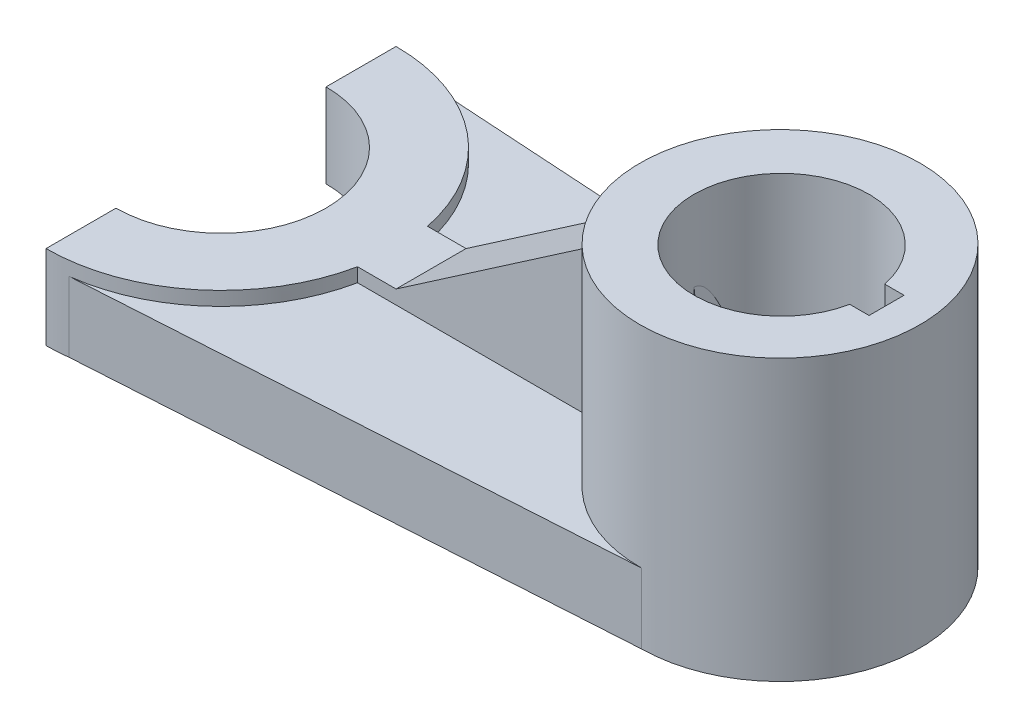
ISO-10303-21;
HEADER;
FILE_DESCRIPTION(('STEP AP214'),'2;1');
FILE_NAME('part.step','',(''),(''),'','','');
FILE_SCHEMA(('AUTOMOTIVE_DESIGN { 1 0 10303 214 1 1 1 1 }'));
ENDSEC;
DATA;
#1=APPLICATION_CONTEXT('core data for automotive mechanical design processes');
#2=APPLICATION_PROTOCOL_DEFINITION('international standard','automotive_design',2000,#1);
#3=PRODUCT_CONTEXT('',#1,'mechanical');
#4=PRODUCT('Part','Part','',(#3));
#5=PRODUCT_RELATED_PRODUCT_CATEGORY('part','',(#4));
#6=PRODUCT_DEFINITION_FORMATION('','',#4);
#7=PRODUCT_DEFINITION_CONTEXT('part definition',#1,'design');
#8=PRODUCT_DEFINITION('design','',#6,#7);
#9=PRODUCT_DEFINITION_SHAPE('','',#8);
#10=(LENGTH_UNIT() NAMED_UNIT(*) SI_UNIT(.MILLI.,.METRE.));
#11=(NAMED_UNIT(*) PLANE_ANGLE_UNIT() SI_UNIT($,.RADIAN.));
#12=(NAMED_UNIT(*) SI_UNIT($,.STERADIAN.) SOLID_ANGLE_UNIT());
#13=UNCERTAINTY_MEASURE_WITH_UNIT(LENGTH_MEASURE(1.E-05),#10,'distance_accuracy_value','');
#14=(GEOMETRIC_REPRESENTATION_CONTEXT(3) GLOBAL_UNCERTAINTY_ASSIGNED_CONTEXT((#13)) GLOBAL_UNIT_ASSIGNED_CONTEXT((#10,
#11,#12)) REPRESENTATION_CONTEXT('',''));
#15=CARTESIAN_POINT('',(0.,0.,0.));
#16=DIRECTION('',(0.,0.,1.));
#17=DIRECTION('',(1.,0.,0.));
#18=AXIS2_PLACEMENT_3D('',#15,#16,#17);
#19=CARTESIAN_POINT('',(-40.,10.0138756603614,0.));
#20=DIRECTION('',(0.,1.,0.));
#21=DIRECTION('',(0.,0.,1.));
#22=AXIS2_PLACEMENT_3D('',#19,#20,#21);
#23=PLANE('',#22);
#24=CARTESIAN_POINT('',(39.8423871101435,10.0138756603614,0.));
#25=DIRECTION('',(0.,1.,0.));
#26=DIRECTION('',(0.,0.,1.));
#27=AXIS2_PLACEMENT_3D('',#24,#25,#26);
#28=CIRCLE('',#27,20.);
#29=CARTESIAN_POINT('',(40.0607651379932,10.0138756603614,19.9988077403867));
#30=VERTEX_POINT('',#29);
#31=CARTESIAN_POINT('',(20.4774703791065,10.0138756603614,5.));
#32=VERTEX_POINT('',#31);
#33=EDGE_CURVE('E273',#30,#32,#28,.F.);
#34=ORIENTED_EDGE('',*,*,#33,.T.);
#35=DIRECTION('',(1.,0.,0.));
#36=VECTOR('',#35,1.);
#37=CARTESIAN_POINT('',(19.8423871101435,10.0138756603614,5.));
#38=LINE('',#37,#36);
#39=CARTESIAN_POINT('',(-15.5051025721682,10.0138756603614,5.));
#40=VERTEX_POINT('',#39);
#41=EDGE_CURVE('E232',#40,#32,#38,.T.);
#42=ORIENTED_EDGE('',*,*,#41,.F.);
#43=CARTESIAN_POINT('',(-40.,10.0138756603614,0.));
#44=DIRECTION('',(0.,1.,0.));
#45=DIRECTION('',(0.,0.,1.));
#46=AXIS2_PLACEMENT_3D('',#43,#44,#45);
#47=CIRCLE('',#46,25.);
#48=CARTESIAN_POINT('',(-36.8895037755445,10.0138756603614,24.8057415377498));
#49=VERTEX_POINT('',#48);
#50=EDGE_CURVE('E293',#40,#49,#47,.F.);
#51=ORIENTED_EDGE('',*,*,#50,.T.);
#52=DIRECTION('',(0.998055524885764,0.,-0.0623311258120947));
#53=VECTOR('',#52,1.);
#54=CARTESIAN_POINT('',(-40.,10.0138756603614,25.));
#55=LINE('',#54,#53);
#56=CARTESIAN_POINT('',(40.0607651379932,10.0138756603614,20.));
#57=VERTEX_POINT('',#56);
#58=EDGE_CURVE('E312',#49,#57,#55,.T.);
#59=ORIENTED_EDGE('',*,*,#58,.T.);
#60=DIRECTION('',(0.,0.,1.));
#61=VECTOR('',#60,1.);
#62=CARTESIAN_POINT('',(40.0607651379932,10.0138756603614,-20.));
#63=LINE('',#62,#61);
#64=EDGE_CURVE('E307',#30,#57,#63,.T.);
#65=ORIENTED_EDGE('',*,*,#64,.F.);
#66=EDGE_LOOP('',(#34,#42,#51,#59,#65));
#67=FACE_BOUND('',#66,.T.);
#68=ADVANCED_FACE('F37',(#67),#23,.T.);
#69=CARTESIAN_POINT('',(-40.,12.,0.));
#70=DIRECTION('',(0.,-1.,0.));
#71=DIRECTION('',(0.,0.,-1.));
#72=AXIS2_PLACEMENT_3D('',#69,#70,#71);
#73=CYLINDRICAL_SURFACE('',#72,25.);
#74=DIRECTION('',(0.,-1.,0.));
#75=VECTOR('',#74,1.);
#76=CARTESIAN_POINT('',(-15.5051025721682,12.,5.));
#77=LINE('',#76,#75);
#78=CARTESIAN_POINT('',(-15.5051025721682,12.,5.));
#79=VERTEX_POINT('',#78);
#80=EDGE_CURVE('E236',#79,#40,#77,.T.);
#81=ORIENTED_EDGE('',*,*,#80,.F.);
#82=CARTESIAN_POINT('',(-40.,12.,0.));
#83=DIRECTION('',(0.,1.,0.));
#84=DIRECTION('',(0.,0.,1.));
#85=AXIS2_PLACEMENT_3D('',#82,#83,#84);
#86=CIRCLE('',#85,25.);
#87=CARTESIAN_POINT('',(-40.,12.,25.));
#88=VERTEX_POINT('',#87);
#89=EDGE_CURVE('E280',#88,#79,#86,.T.);
#90=ORIENTED_EDGE('',*,*,#89,.F.);
#91=DIRECTION('',(0.,-1.,0.));
#92=VECTOR('',#91,1.);
#93=CARTESIAN_POINT('',(-40.,10.0138756603614,25.));
#94=LINE('',#93,#92);
#95=CARTESIAN_POINT('',(-40.,0.,25.));
#96=VERTEX_POINT('',#95);
#97=EDGE_CURVE('E337',#88,#96,#94,.T.);
#98=ORIENTED_EDGE('',*,*,#97,.T.);
#99=CARTESIAN_POINT('',(-40.,0.,0.));
#100=DIRECTION('',(0.,1.,0.));
#101=DIRECTION('',(0.,0.,1.));
#102=AXIS2_PLACEMENT_3D('',#99,#100,#101);
#103=CIRCLE('',#102,25.);
#104=CARTESIAN_POINT('',(-36.8895037755445,0.,24.8057415377498));
#105=VERTEX_POINT('',#104);
#106=EDGE_CURVE('E294',#96,#105,#103,.T.);
#107=ORIENTED_EDGE('',*,*,#106,.T.);
#108=DIRECTION('',(0.,-1.,0.));
#109=VECTOR('',#108,1.);
#110=CARTESIAN_POINT('',(-36.8895037755445,12.,24.8057415377498));
#111=LINE('',#110,#109);
#112=EDGE_CURVE('E301',#105,#49,#111,.F.);
#113=ORIENTED_EDGE('',*,*,#112,.T.);
#114=ORIENTED_EDGE('',*,*,#50,.F.);
#115=EDGE_LOOP('',(#81,#90,#98,#107,#113,#114));
#116=FACE_BOUND('',#115,.T.);
#117=ADVANCED_FACE('F367',(#116),#73,.T.);
#118=CARTESIAN_POINT('',(39.8423871101435,40.,0.));
#119=DIRECTION('',(0.,-1.,0.));
#120=DIRECTION('',(0.,0.,-1.));
#121=AXIS2_PLACEMENT_3D('',#118,#119,#120);
#122=CYLINDRICAL_SURFACE('',#121,20.);
#123=CARTESIAN_POINT('',(39.8423871101435,40.,0.));
#124=DIRECTION('',(0.,1.,0.));
#125=DIRECTION('',(0.,0.,1.));
#126=AXIS2_PLACEMENT_3D('',#123,#124,#125);
#127=CIRCLE('',#126,20.);
#128=CARTESIAN_POINT('',(39.8423871101435,40.,20.));
#129=VERTEX_POINT('',#128);
#130=EDGE_CURVE('E265',#129,#129,#127,.T.);
#131=ORIENTED_EDGE('',*,*,#130,.F.);
#132=EDGE_LOOP('',(#131));
#133=FACE_BOUND('',#132,.T.);
#134=DIRECTION('',(0.,-1.,0.));
#135=VECTOR('',#134,1.);
#136=CARTESIAN_POINT('',(20.4774703791065,40.,-5.));
#137=LINE('',#136,#135);
#138=CARTESIAN_POINT('',(20.4774703791065,10.0138756603614,-5.));
#139=VERTEX_POINT('',#138);
#140=CARTESIAN_POINT('',(20.4774703791065,32.9362656032069,-5.));
#141=VERTEX_POINT('',#140);
#142=EDGE_CURVE('E226',#139,#141,#137,.F.);
#143=ORIENTED_EDGE('',*,*,#142,.T.);
#144=CARTESIAN_POINT('',(39.8423871101435,46.2388473142834,0.));
#145=DIRECTION('',(-0.566216670274575,0.824256442075628,0.));
#146=DIRECTION('',(-0.824256442075628,-0.566216670274575,0.));
#147=AXIS2_PLACEMENT_3D('',#144,#145,#146);
#148=ELLIPSE('',#147,24.2642932212169,20.);
#149=CARTESIAN_POINT('',(20.4774703791065,32.9362656032069,5.));
#150=VERTEX_POINT('',#149);
#151=EDGE_CURVE('E52',#141,#150,#148,.T.);
#152=ORIENTED_EDGE('',*,*,#151,.T.);
#153=DIRECTION('',(0.,-1.,0.));
#154=VECTOR('',#153,1.);
#155=CARTESIAN_POINT('',(20.4774703791065,40.,5.));
#156=LINE('',#155,#154);
#157=EDGE_CURVE('E352',#32,#150,#156,.F.);
#158=ORIENTED_EDGE('',*,*,#157,.F.);
#159=ORIENTED_EDGE('',*,*,#33,.F.);
#160=DIRECTION('',(0.,-1.,0.));
#161=VECTOR('',#160,1.);
#162=CARTESIAN_POINT('',(40.0607651379932,40.,19.9988077403867));
#163=LINE('',#162,#161);
#164=CARTESIAN_POINT('',(40.0607651379932,0.,19.9988077403867));
#165=VERTEX_POINT('',#164);
#166=EDGE_CURVE('E276',#165,#30,#163,.F.);
#167=ORIENTED_EDGE('',*,*,#166,.F.);
#168=CARTESIAN_POINT('',(39.8423871101435,0.,0.));
#169=DIRECTION('',(0.,1.,0.));
#170=DIRECTION('',(0.,0.,1.));
#171=AXIS2_PLACEMENT_3D('',#168,#169,#170);
#172=CIRCLE('',#171,20.);
#173=CARTESIAN_POINT('',(40.0607651379932,0.,-19.9988077403867));
#174=VERTEX_POINT('',#173);
#175=EDGE_CURVE('E262',#165,#174,#172,.T.);
#176=ORIENTED_EDGE('',*,*,#175,.T.);
#177=DIRECTION('',(0.,-1.,0.));
#178=VECTOR('',#177,1.);
#179=CARTESIAN_POINT('',(40.0607651379932,40.,-19.9988077403867));
#180=LINE('',#179,#178);
#181=CARTESIAN_POINT('',(40.0607651379932,10.0138756603614,-19.9988077403867));
#182=VERTEX_POINT('',#181);
#183=EDGE_CURVE('E268',#182,#174,#180,.T.);
#184=ORIENTED_EDGE('',*,*,#183,.F.);
#185=EDGE_CURVE('E272',#139,#182,#28,.F.);
#186=ORIENTED_EDGE('',*,*,#185,.F.);
#187=EDGE_LOOP('',(#143,#152,#158,#159,#167,#176,#184,#186));
#188=FACE_BOUND('',#187,.T.);
#189=ADVANCED_FACE('F374',(#133,#188),#122,.T.);
#190=CARTESIAN_POINT('',(40.0607651379932,10.0138756603614,-20.));
#191=DIRECTION('',(1.,0.,0.));
#192=DIRECTION('',(0.,0.,-1.));
#193=AXIS2_PLACEMENT_3D('',#190,#191,#192);
#194=PLANE('',#193);
#195=DIRECTION('',(0.,0.,1.));
#196=VECTOR('',#195,1.);
#197=CARTESIAN_POINT('',(40.0607651379932,0.,-20.));
#198=LINE('',#197,#196);
#199=CARTESIAN_POINT('',(40.0607651379932,0.,20.));
#200=VERTEX_POINT('',#199);
#201=EDGE_CURVE('E320',#165,#200,#198,.T.);
#202=ORIENTED_EDGE('',*,*,#201,.F.);
#203=ORIENTED_EDGE('',*,*,#166,.T.);
#204=ORIENTED_EDGE('',*,*,#64,.T.);
#205=DIRECTION('',(0.,-1.,0.));
#206=VECTOR('',#205,1.);
#207=CARTESIAN_POINT('',(40.0607651379932,10.0138756603614,20.));
#208=LINE('',#207,#206);
#209=EDGE_CURVE('E339',#57,#200,#208,.T.);
#210=ORIENTED_EDGE('',*,*,#209,.T.);
#211=EDGE_LOOP('',(#202,#203,#204,#210));
#212=FACE_BOUND('',#211,.T.);
#213=ADVANCED_FACE('F397',(#212),#194,.T.);
#214=CARTESIAN_POINT('',(40.0607651379932,10.0138756603614,-20.));
#215=VERTEX_POINT('',#214);
#216=EDGE_CURVE('E309',#215,#182,#63,.T.);
#217=ORIENTED_EDGE('',*,*,#216,.T.);
#218=ORIENTED_EDGE('',*,*,#183,.T.);
#219=CARTESIAN_POINT('',(40.0607651379932,0.,-20.));
#220=VERTEX_POINT('',#219);
#221=EDGE_CURVE('E321',#220,#174,#198,.T.);
#222=ORIENTED_EDGE('',*,*,#221,.F.);
#223=DIRECTION('',(0.,-1.,0.));
#224=VECTOR('',#223,1.);
#225=CARTESIAN_POINT('',(40.0607651379932,10.0138756603614,-20.));
#226=LINE('',#225,#224);
#227=EDGE_CURVE('E342',#215,#220,#226,.T.);
#228=ORIENTED_EDGE('',*,*,#227,.F.);
#229=EDGE_LOOP('',(#217,#218,#222,#228));
#230=FACE_BOUND('',#229,.T.);
#231=ADVANCED_FACE('F392',(#230),#194,.T.);
#232=CARTESIAN_POINT('',(-40.,10.0138756603614,25.));
#233=DIRECTION('',(-0.0623311258120947,0.,-0.998055524885763));
#234=DIRECTION('',(-0.998055524885764,0.,0.0623311258120947));
#235=AXIS2_PLACEMENT_3D('',#232,#233,#234);
#236=PLANE('',#235);
#237=ORIENTED_EDGE('',*,*,#112,.F.);
#238=DIRECTION('',(0.998055524885764,0.,-0.0623311258120947));
#239=VECTOR('',#238,1.);
#240=CARTESIAN_POINT('',(-40.,0.,25.));
#241=LINE('',#240,#239);
#242=EDGE_CURVE('E324',#105,#200,#241,.T.);
#243=ORIENTED_EDGE('',*,*,#242,.T.);
#244=ORIENTED_EDGE('',*,*,#209,.F.);
#245=ORIENTED_EDGE('',*,*,#58,.F.);
#246=EDGE_LOOP('',(#237,#243,#244,#245));
#247=FACE_BOUND('',#246,.T.);
#248=ADVANCED_FACE('F387',(#247),#236,.F.);
#249=CARTESIAN_POINT('',(-40.,10.0138756603614,-25.));
#250=DIRECTION('',(0.0623311258120947,0.,-0.998055524885763));
#251=DIRECTION('',(-0.998055524885764,0.,-0.0623311258120947));
#252=AXIS2_PLACEMENT_3D('',#249,#250,#251);
#253=PLANE('',#252);
#254=DIRECTION('',(0.998055524885764,0.,0.0623311258120947));
#255=VECTOR('',#254,1.);
#256=CARTESIAN_POINT('',(-40.,0.,-25.));
#257=LINE('',#256,#255);
#258=CARTESIAN_POINT('',(-36.8895037755445,0.,-24.8057415377498));
#259=VERTEX_POINT('',#258);
#260=EDGE_CURVE('E318',#259,#220,#257,.T.);
#261=ORIENTED_EDGE('',*,*,#260,.F.);
#262=DIRECTION('',(0.,-1.,0.));
#263=VECTOR('',#262,1.);
#264=CARTESIAN_POINT('',(-36.8895037755445,12.,-24.8057415377498));
#265=LINE('',#264,#263);
#266=CARTESIAN_POINT('',(-36.8895037755445,10.0138756603614,-24.8057415377498));
#267=VERTEX_POINT('',#266);
#268=EDGE_CURVE('E298',#259,#267,#265,.F.);
#269=ORIENTED_EDGE('',*,*,#268,.T.);
#270=DIRECTION('',(0.998055524885764,0.,0.0623311258120947));
#271=VECTOR('',#270,1.);
#272=CARTESIAN_POINT('',(-40.,10.0138756603614,-25.));
#273=LINE('',#272,#271);
#274=EDGE_CURVE('E305',#267,#215,#273,.T.);
#275=ORIENTED_EDGE('',*,*,#274,.T.);
#276=ORIENTED_EDGE('',*,*,#227,.T.);
#277=EDGE_LOOP('',(#261,#269,#275,#276));
#278=FACE_BOUND('',#277,.T.);
#279=ADVANCED_FACE('F380',(#278),#253,.T.);
#280=DIRECTION('',(1.,0.,0.));
#281=VECTOR('',#280,1.);
#282=CARTESIAN_POINT('',(-16.6245558974217,10.0138756603614,-5.));
#283=LINE('',#282,#281);
#284=CARTESIAN_POINT('',(-15.5051025721682,10.0138756603614,-5.));
#285=VERTEX_POINT('',#284);
#286=EDGE_CURVE('E60',#285,#139,#283,.T.);
#287=ORIENTED_EDGE('',*,*,#286,.T.);
#288=ORIENTED_EDGE('',*,*,#185,.T.);
#289=ORIENTED_EDGE('',*,*,#216,.F.);
#290=ORIENTED_EDGE('',*,*,#274,.F.);
#291=EDGE_CURVE('E296',#267,#285,#47,.F.);
#292=ORIENTED_EDGE('',*,*,#291,.T.);
#293=EDGE_LOOP('',(#287,#288,#289,#290,#292));
#294=FACE_BOUND('',#293,.T.);
#295=ADVANCED_FACE('F370',(#294),#23,.T.);
#296=CARTESIAN_POINT('',(-40.,10.0138756603614,-15.));
#297=DIRECTION('',(-1.,0.,0.));
#298=DIRECTION('',(0.,0.,1.));
#299=AXIS2_PLACEMENT_3D('',#296,#297,#298);
#300=PLANE('',#299);
#301=DIRECTION('',(0.,0.,-1.));
#302=VECTOR('',#301,1.);
#303=CARTESIAN_POINT('',(-40.,0.,-15.));
#304=LINE('',#303,#302);
#305=CARTESIAN_POINT('',(-40.,0.,-15.));
#306=VERTEX_POINT('',#305);
#307=CARTESIAN_POINT('',(-40.,0.,-25.));
#308=VERTEX_POINT('',#307);
#309=EDGE_CURVE('E304',#306,#308,#304,.T.);
#310=ORIENTED_EDGE('',*,*,#309,.F.);
#311=DIRECTION('',(0.,-1.,0.));
#312=VECTOR('',#311,1.);
#313=CARTESIAN_POINT('',(-40.,10.0138756603614,-15.));
#314=LINE('',#313,#312);
#315=CARTESIAN_POINT('',(-40.,12.,-15.));
#316=VERTEX_POINT('',#315);
#317=EDGE_CURVE('E332',#316,#306,#314,.T.);
#318=ORIENTED_EDGE('',*,*,#317,.F.);
#319=DIRECTION('',(0.,0.,1.));
#320=VECTOR('',#319,1.);
#321=CARTESIAN_POINT('',(-40.,12.,-25.));
#322=LINE('',#321,#320);
#323=CARTESIAN_POINT('',(-40.,12.,-25.));
#324=VERTEX_POINT('',#323);
#325=EDGE_CURVE('E283',#324,#316,#322,.T.);
#326=ORIENTED_EDGE('',*,*,#325,.F.);
#327=DIRECTION('',(0.,-1.,0.));
#328=VECTOR('',#327,1.);
#329=CARTESIAN_POINT('',(-40.,10.0138756603614,-25.));
#330=LINE('',#329,#328);
#331=EDGE_CURVE('E315',#324,#308,#330,.T.);
#332=ORIENTED_EDGE('',*,*,#331,.T.);
#333=EDGE_LOOP('',(#310,#318,#326,#332));
#334=FACE_BOUND('',#333,.T.);
#335=ADVANCED_FACE('F39',(#334),#300,.T.);
#336=CARTESIAN_POINT('',(-40.,10.0138756603614,0.));
#337=DIRECTION('',(0.,-1.,0.));
#338=DIRECTION('',(0.,0.,-1.));
#339=AXIS2_PLACEMENT_3D('',#336,#337,#338);
#340=CYLINDRICAL_SURFACE('',#339,15.);
#341=CARTESIAN_POINT('',(-40.,0.,0.));
#342=DIRECTION('',(0.,1.,0.));
#343=DIRECTION('',(0.,0.,1.));
#344=AXIS2_PLACEMENT_3D('',#341,#342,#343);
#345=CIRCLE('',#344,15.);
#346=CARTESIAN_POINT('',(-40.,0.,15.));
#347=VERTEX_POINT('',#346);
#348=EDGE_CURVE('E308',#347,#306,#345,.T.);
#349=ORIENTED_EDGE('',*,*,#348,.F.);
#350=DIRECTION('',(0.,-1.,0.));
#351=VECTOR('',#350,1.);
#352=CARTESIAN_POINT('',(-40.,10.0138756603614,15.));
#353=LINE('',#352,#351);
#354=CARTESIAN_POINT('',(-40.,12.,15.));
#355=VERTEX_POINT('',#354);
#356=EDGE_CURVE('E335',#355,#347,#353,.T.);
#357=ORIENTED_EDGE('',*,*,#356,.F.);
#358=CARTESIAN_POINT('',(-40.,12.,0.));
#359=DIRECTION('',(0.,-1.,0.));
#360=DIRECTION('',(0.,0.,1.));
#361=AXIS2_PLACEMENT_3D('',#358,#359,#360);
#362=CIRCLE('',#361,15.);
#363=EDGE_CURVE('E287',#316,#355,#362,.T.);
#364=ORIENTED_EDGE('',*,*,#363,.F.);
#365=ORIENTED_EDGE('',*,*,#317,.T.);
#366=EDGE_LOOP('',(#349,#357,#364,#365));
#367=FACE_BOUND('',#366,.T.);
#368=ADVANCED_FACE('F385',(#367),#340,.F.);
#369=CARTESIAN_POINT('',(-40.,10.0138756603614,25.));
#370=DIRECTION('',(-1.,0.,0.));
#371=DIRECTION('',(0.,0.,1.));
#372=AXIS2_PLACEMENT_3D('',#369,#370,#371);
#373=PLANE('',#372);
#374=DIRECTION('',(0.,0.,-1.));
#375=VECTOR('',#374,1.);
#376=CARTESIAN_POINT('',(-40.,0.,25.));
#377=LINE('',#376,#375);
#378=EDGE_CURVE('E327',#96,#347,#377,.T.);
#379=ORIENTED_EDGE('',*,*,#378,.F.);
#380=ORIENTED_EDGE('',*,*,#97,.F.);
#381=DIRECTION('',(0.,0.,1.));
#382=VECTOR('',#381,1.);
#383=CARTESIAN_POINT('',(-40.,12.,15.));
#384=LINE('',#383,#382);
#385=EDGE_CURVE('E290',#355,#88,#384,.T.);
#386=ORIENTED_EDGE('',*,*,#385,.F.);
#387=ORIENTED_EDGE('',*,*,#356,.T.);
#388=EDGE_LOOP('',(#379,#380,#386,#387));
#389=FACE_BOUND('',#388,.T.);
#390=ADVANCED_FACE('F401',(#389),#373,.T.);
#391=CARTESIAN_POINT('',(-40.,0.,0.));
#392=DIRECTION('',(0.,1.,0.));
#393=DIRECTION('',(0.,0.,1.));
#394=AXIS2_PLACEMENT_3D('',#391,#392,#393);
#395=PLANE('',#394);
#396=CARTESIAN_POINT('',(40.0607651379932,0.,0.));
#397=DIRECTION('',(0.,1.,0.));
#398=DIRECTION('',(0.,0.,1.));
#399=AXIS2_PLACEMENT_3D('',#396,#397,#398);
#400=CIRCLE('',#399,12.5);
#401=CARTESIAN_POINT('',(52.3082937325827,0.,-2.4996086343092));
#402=VERTEX_POINT('',#401);
#403=CARTESIAN_POINT('',(52.308335521284,0.,2.49940387019337));
#404=VERTEX_POINT('',#403);
#405=EDGE_CURVE('E258',#402,#404,#400,.T.);
#406=ORIENTED_EDGE('',*,*,#405,.T.);
#407=DIRECTION('',(-1.,0.,0.));
#408=VECTOR('',#407,1.);
#409=CARTESIAN_POINT('',(0.,0.,2.49940387019337));
#410=LINE('',#409,#408);
#411=CARTESIAN_POINT('',(55.0607651379932,0.,2.49940387019337));
#412=VERTEX_POINT('',#411);
#413=EDGE_CURVE('E238',#412,#404,#410,.T.);
#414=ORIENTED_EDGE('',*,*,#413,.F.);
#415=DIRECTION('',(0.,0.,1.));
#416=VECTOR('',#415,1.);
#417=CARTESIAN_POINT('',(55.0607651379932,0.,0.));
#418=LINE('',#417,#416);
#419=CARTESIAN_POINT('',(55.0607651379932,0.,-2.4996086343092));
#420=VERTEX_POINT('',#419);
#421=EDGE_CURVE('E250',#420,#412,#418,.T.);
#422=ORIENTED_EDGE('',*,*,#421,.F.);
#423=DIRECTION('',(-1.,0.,0.));
#424=VECTOR('',#423,1.);
#425=CARTESIAN_POINT('',(0.,0.,-2.4996086343092));
#426=LINE('',#425,#424);
#427=EDGE_CURVE('E243',#420,#402,#426,.T.);
#428=ORIENTED_EDGE('',*,*,#427,.T.);
#429=EDGE_LOOP('',(#406,#414,#422,#428));
#430=FACE_BOUND('',#429,.T.);
#431=ORIENTED_EDGE('',*,*,#221,.T.);
#432=ORIENTED_EDGE('',*,*,#175,.F.);
#433=ORIENTED_EDGE('',*,*,#201,.T.);
#434=ORIENTED_EDGE('',*,*,#242,.F.);
#435=ORIENTED_EDGE('',*,*,#106,.F.);
#436=ORIENTED_EDGE('',*,*,#378,.T.);
#437=ORIENTED_EDGE('',*,*,#348,.T.);
#438=ORIENTED_EDGE('',*,*,#309,.T.);
#439=EDGE_CURVE('E279',#259,#308,#103,.T.);
#440=ORIENTED_EDGE('',*,*,#439,.F.);
#441=ORIENTED_EDGE('',*,*,#260,.T.);
#442=EDGE_LOOP('',(#431,#432,#433,#434,#435,#436,#437,#438,#440,#441));
#443=FACE_BOUND('',#442,.T.);
#444=ADVANCED_FACE('F404',(#430,#443),#395,.F.);
#445=CARTESIAN_POINT('',(-15.5051025721682,12.,-5.));
#446=VERTEX_POINT('',#445);
#447=EDGE_CURVE('E284',#446,#324,#86,.T.);
#448=ORIENTED_EDGE('',*,*,#447,.F.);
#449=DIRECTION('',(0.,-1.,0.));
#450=VECTOR('',#449,1.);
#451=CARTESIAN_POINT('',(-15.5051025721682,12.,-5.));
#452=LINE('',#451,#450);
#453=EDGE_CURVE('E224',#446,#285,#452,.T.);
#454=ORIENTED_EDGE('',*,*,#453,.T.);
#455=ORIENTED_EDGE('',*,*,#291,.F.);
#456=ORIENTED_EDGE('',*,*,#268,.F.);
#457=ORIENTED_EDGE('',*,*,#439,.T.);
#458=ORIENTED_EDGE('',*,*,#331,.F.);
#459=EDGE_LOOP('',(#448,#454,#455,#456,#457,#458));
#460=FACE_BOUND('',#459,.T.);
#461=ADVANCED_FACE('F377',(#460),#73,.T.);
#462=CARTESIAN_POINT('',(-40.,12.,0.));
#463=DIRECTION('',(0.,1.,0.));
#464=DIRECTION('',(0.,0.,1.));
#465=AXIS2_PLACEMENT_3D('',#462,#463,#464);
#466=PLANE('',#465);
#467=DIRECTION('',(-1.,0.,0.));
#468=VECTOR('',#467,1.);
#469=CARTESIAN_POINT('',(-9.99999999999999,12.,-5.));
#470=LINE('',#469,#468);
#471=CARTESIAN_POINT('',(-9.99999999999999,12.,-5.));
#472=VERTEX_POINT('',#471);
#473=EDGE_CURVE('E208',#472,#446,#470,.T.);
#474=ORIENTED_EDGE('',*,*,#473,.T.);
#475=ORIENTED_EDGE('',*,*,#447,.T.);
#476=ORIENTED_EDGE('',*,*,#325,.T.);
#477=ORIENTED_EDGE('',*,*,#363,.T.);
#478=ORIENTED_EDGE('',*,*,#385,.T.);
#479=ORIENTED_EDGE('',*,*,#89,.T.);
#480=DIRECTION('',(1.,0.,0.));
#481=VECTOR('',#480,1.);
#482=CARTESIAN_POINT('',(-15.,12.,5.));
#483=LINE('',#482,#481);
#484=CARTESIAN_POINT('',(-9.99999999999999,12.,5.));
#485=VERTEX_POINT('',#484);
#486=EDGE_CURVE('E228',#79,#485,#483,.T.);
#487=ORIENTED_EDGE('',*,*,#486,.T.);
#488=DIRECTION('',(0.,0.,-1.));
#489=VECTOR('',#488,1.);
#490=CARTESIAN_POINT('',(-9.99999999999999,12.,5.));
#491=LINE('',#490,#489);
#492=EDGE_CURVE('E234',#485,#472,#491,.T.);
#493=ORIENTED_EDGE('',*,*,#492,.T.);
#494=EDGE_LOOP('',(#474,#475,#476,#477,#478,#479,#487,#493));
#495=FACE_BOUND('',#494,.T.);
#496=ADVANCED_FACE('F413',(#495),#466,.T.);
#497=CARTESIAN_POINT('',(39.8423871101435,40.,0.));
#498=DIRECTION('',(0.,1.,0.));
#499=DIRECTION('',(0.,0.,1.));
#500=AXIS2_PLACEMENT_3D('',#497,#498,#499);
#501=PLANE('',#500);
#502=DIRECTION('',(-1.,0.,0.));
#503=VECTOR('',#502,1.);
#504=CARTESIAN_POINT('',(0.,40.,2.49940387019337));
#505=LINE('',#504,#503);
#506=CARTESIAN_POINT('',(55.0607651379932,40.,2.49940387019337));
#507=VERTEX_POINT('',#506);
#508=CARTESIAN_POINT('',(52.308335521284,40.,2.49940387019337));
#509=VERTEX_POINT('',#508);
#510=EDGE_CURVE('E239',#507,#509,#505,.T.);
#511=ORIENTED_EDGE('',*,*,#510,.T.);
#512=CARTESIAN_POINT('',(40.0607651379932,40.,0.));
#513=DIRECTION('',(0.,1.,0.));
#514=DIRECTION('',(0.,0.,1.));
#515=AXIS2_PLACEMENT_3D('',#512,#513,#514);
#516=CIRCLE('',#515,12.5);
#517=CARTESIAN_POINT('',(52.3082937325827,40.,-2.4996086343092));
#518=VERTEX_POINT('',#517);
#519=EDGE_CURVE('E259',#518,#509,#516,.T.);
#520=ORIENTED_EDGE('',*,*,#519,.F.);
#521=DIRECTION('',(-1.,0.,0.));
#522=VECTOR('',#521,1.);
#523=CARTESIAN_POINT('',(0.,40.,-2.4996086343092));
#524=LINE('',#523,#522);
#525=CARTESIAN_POINT('',(55.0607651379932,40.,-2.4996086343092));
#526=VERTEX_POINT('',#525);
#527=EDGE_CURVE('E246',#526,#518,#524,.T.);
#528=ORIENTED_EDGE('',*,*,#527,.F.);
#529=DIRECTION('',(0.,0.,1.));
#530=VECTOR('',#529,1.);
#531=CARTESIAN_POINT('',(55.0607651379932,40.,0.));
#532=LINE('',#531,#530);
#533=EDGE_CURVE('E242',#526,#507,#532,.T.);
#534=ORIENTED_EDGE('',*,*,#533,.T.);
#535=EDGE_LOOP('',(#511,#520,#528,#534));
#536=FACE_BOUND('',#535,.T.);
#537=ORIENTED_EDGE('',*,*,#130,.T.);
#538=EDGE_LOOP('',(#537));
#539=FACE_BOUND('',#538,.T.);
#540=ADVANCED_FACE('F479',(#536,#539),#501,.T.);
#541=CARTESIAN_POINT('',(40.0607651379932,40.,0.));
#542=DIRECTION('',(0.,-1.,0.));
#543=DIRECTION('',(0.,0.,-1.));
#544=AXIS2_PLACEMENT_3D('',#541,#542,#543);
#545=CYLINDRICAL_SURFACE('',#544,12.5);
#546=DIRECTION('',(0.,-1.,0.));
#547=VECTOR('',#546,1.);
#548=CARTESIAN_POINT('',(28.6043259006036,40.,-5.));
#549=LINE('',#548,#547);
#550=CARTESIAN_POINT('',(28.6043259006036,10.0138756603614,-5.));
#551=VERTEX_POINT('',#550);
#552=CARTESIAN_POINT('',(28.6043259006036,19.8396845449498,-5.));
#553=VERTEX_POINT('',#552);
#554=EDGE_CURVE('E11',#551,#553,#549,.F.);
#555=ORIENTED_EDGE('',*,*,#554,.F.);
#556=CARTESIAN_POINT('',(40.0607651379932,10.0138756603614,0.));
#557=DIRECTION('',(0.,-1.,0.));
#558=DIRECTION('',(0.,0.,-1.));
#559=AXIS2_PLACEMENT_3D('',#556,#557,#558);
#560=CIRCLE('',#559,12.5);
#561=CARTESIAN_POINT('',(27.5607651379932,10.0138756603614,0.));
#562=VERTEX_POINT('',#561);
#563=EDGE_CURVE('E195',#562,#551,#560,.T.);
#564=ORIENTED_EDGE('',*,*,#563,.F.);
#565=DIRECTION('',(0.,-1.,0.));
#566=VECTOR('',#565,1.);
#567=CARTESIAN_POINT('',(27.5607651379932,40.,0.));
#568=LINE('',#567,#566);
#569=CARTESIAN_POINT('',(27.5607651379932,28.4885821392949,0.));
#570=VERTEX_POINT('',#569);
#571=EDGE_CURVE('E207',#562,#570,#568,.F.);
#572=ORIENTED_EDGE('',*,*,#571,.T.);
#573=CARTESIAN_POINT('',(40.0607651379932,-75.1098127053717,0.));
#574=DIRECTION('',(0.992799322664382,0.119789419053375,0.));
#575=DIRECTION('',(0.119789419053375,-0.992799322664382,0.));
#576=AXIS2_PLACEMENT_3D('',#573,#574,#575);
#577=ELLIPSE('',#576,104.349783969069,12.5);
#578=EDGE_CURVE('E45',#553,#570,#577,.T.);
#579=ORIENTED_EDGE('',*,*,#578,.F.);
#580=EDGE_LOOP('',(#555,#564,#572,#579));
#581=FACE_BOUND('',#580,.T.);
#582=DIRECTION('',(0.,-1.,0.));
#583=VECTOR('',#582,1.);
#584=CARTESIAN_POINT('',(52.308335521284,40.,2.49940387019337));
#585=LINE('',#584,#583);
#586=EDGE_CURVE('E349',#404,#509,#585,.F.);
#587=ORIENTED_EDGE('',*,*,#586,.F.);
#588=ORIENTED_EDGE('',*,*,#405,.F.);
#589=DIRECTION('',(0.,-1.,0.));
#590=VECTOR('',#589,1.);
#591=CARTESIAN_POINT('',(52.3082937325827,40.,-2.4996086343092));
#592=LINE('',#591,#590);
#593=EDGE_CURVE('E334',#402,#518,#592,.F.);
#594=ORIENTED_EDGE('',*,*,#593,.T.);
#595=ORIENTED_EDGE('',*,*,#519,.T.);
#596=EDGE_LOOP('',(#587,#588,#594,#595));
#597=FACE_BOUND('',#596,.T.);
#598=ADVANCED_FACE('F354',(#581,#597),#545,.F.);
#599=CARTESIAN_POINT('',(0.,40.,2.49940387019337));
#600=DIRECTION('',(0.,0.,1.));
#601=DIRECTION('',(1.,0.,0.));
#602=AXIS2_PLACEMENT_3D('',#599,#600,#601);
#603=PLANE('',#602);
#604=ORIENTED_EDGE('',*,*,#586,.T.);
#605=ORIENTED_EDGE('',*,*,#510,.F.);
#606=DIRECTION('',(0.,-1.,0.));
#607=VECTOR('',#606,1.);
#608=CARTESIAN_POINT('',(55.0607651379932,40.,2.49940387019337));
#609=LINE('',#608,#607);
#610=EDGE_CURVE('E256',#507,#412,#609,.T.);
#611=ORIENTED_EDGE('',*,*,#610,.T.);
#612=ORIENTED_EDGE('',*,*,#413,.T.);
#613=EDGE_LOOP('',(#604,#605,#611,#612));
#614=FACE_BOUND('',#613,.T.);
#615=ADVANCED_FACE('F472',(#614),#603,.F.);
#616=CARTESIAN_POINT('',(55.0607651379932,40.,0.));
#617=DIRECTION('',(1.,0.,0.));
#618=DIRECTION('',(0.,0.,-1.));
#619=AXIS2_PLACEMENT_3D('',#616,#617,#618);
#620=PLANE('',#619);
#621=ORIENTED_EDGE('',*,*,#421,.T.);
#622=ORIENTED_EDGE('',*,*,#610,.F.);
#623=ORIENTED_EDGE('',*,*,#533,.F.);
#624=DIRECTION('',(0.,-1.,0.));
#625=VECTOR('',#624,1.);
#626=CARTESIAN_POINT('',(55.0607651379932,40.,-2.4996086343092));
#627=LINE('',#626,#625);
#628=EDGE_CURVE('E248',#526,#420,#627,.T.);
#629=ORIENTED_EDGE('',*,*,#628,.T.);
#630=EDGE_LOOP('',(#621,#622,#623,#629));
#631=FACE_BOUND('',#630,.T.);
#632=ADVANCED_FACE('F468',(#631),#620,.F.);
#633=CARTESIAN_POINT('',(0.,40.,-2.4996086343092));
#634=DIRECTION('',(0.,0.,1.));
#635=DIRECTION('',(1.,0.,0.));
#636=AXIS2_PLACEMENT_3D('',#633,#634,#635);
#637=PLANE('',#636);
#638=ORIENTED_EDGE('',*,*,#427,.F.);
#639=ORIENTED_EDGE('',*,*,#628,.F.);
#640=ORIENTED_EDGE('',*,*,#527,.T.);
#641=ORIENTED_EDGE('',*,*,#593,.F.);
#642=EDGE_LOOP('',(#638,#639,#640,#641));
#643=FACE_BOUND('',#642,.T.);
#644=ADVANCED_FACE('F462',(#643),#637,.T.);
#645=CARTESIAN_POINT('',(0.,0.,5.));
#646=DIRECTION('',(0.,0.,-1.));
#647=DIRECTION('',(-1.,0.,0.));
#648=AXIS2_PLACEMENT_3D('',#645,#646,#647);
#649=PLANE('',#648);
#650=ORIENTED_EDGE('',*,*,#486,.F.);
#651=ORIENTED_EDGE('',*,*,#80,.T.);
#652=ORIENTED_EDGE('',*,*,#41,.T.);
#653=ORIENTED_EDGE('',*,*,#157,.T.);
#654=DIRECTION('',(0.824256442075628,0.566216670274575,0.));
#655=VECTOR('',#654,1.);
#656=CARTESIAN_POINT('',(-9.99999999999999,12.,5.));
#657=LINE('',#656,#655);
#658=EDGE_CURVE('E230',#485,#150,#657,.T.);
#659=ORIENTED_EDGE('',*,*,#658,.F.);
#660=EDGE_LOOP('',(#650,#651,#652,#653,#659));
#661=FACE_BOUND('',#660,.T.);
#662=ADVANCED_FACE('F453',(#661),#649,.F.);
#663=CARTESIAN_POINT('',(19.8423871101435,32.5,5.));
#664=DIRECTION('',(-0.566216670274575,0.824256442075628,0.));
#665=DIRECTION('',(-0.824256442075628,-0.566216670274575,0.));
#666=AXIS2_PLACEMENT_3D('',#663,#664,#665);
#667=PLANE('',#666);
#668=ORIENTED_EDGE('',*,*,#151,.F.);
#669=DIRECTION('',(0.824256442075628,0.566216670274575,0.));
#670=VECTOR('',#669,1.);
#671=CARTESIAN_POINT('',(19.8423871101435,32.5,-5.));
#672=LINE('',#671,#670);
#673=EDGE_CURVE('E211',#472,#141,#672,.T.);
#674=ORIENTED_EDGE('',*,*,#673,.F.);
#675=ORIENTED_EDGE('',*,*,#492,.F.);
#676=ORIENTED_EDGE('',*,*,#658,.T.);
#677=EDGE_LOOP('',(#668,#674,#675,#676));
#678=FACE_BOUND('',#677,.T.);
#679=ADVANCED_FACE('F455',(#678),#667,.T.);
#680=CARTESIAN_POINT('',(0.,0.,-5.));
#681=DIRECTION('',(0.,0.,-1.));
#682=DIRECTION('',(-1.,0.,0.));
#683=AXIS2_PLACEMENT_3D('',#680,#681,#682);
#684=PLANE('',#683);
#685=ORIENTED_EDGE('',*,*,#142,.F.);
#686=ORIENTED_EDGE('',*,*,#286,.F.);
#687=ORIENTED_EDGE('',*,*,#453,.F.);
#688=ORIENTED_EDGE('',*,*,#473,.F.);
#689=ORIENTED_EDGE('',*,*,#673,.T.);
#690=EDGE_LOOP('',(#685,#686,#687,#688,#689));
#691=FACE_BOUND('',#690,.T.);
#692=ADVANCED_FACE('F364',(#691),#684,.T.);
#693=CARTESIAN_POINT('',(29.7898907082583,10.0138756603614,-5.));
#694=DIRECTION('',(0.992799322664382,0.119789419053375,0.));
#695=DIRECTION('',(-0.119789419053375,0.992799322664382,0.));
#696=AXIS2_PLACEMENT_3D('',#693,#694,#695);
#697=PLANE('',#696);
#698=DIRECTION('',(-0.119789419053375,0.992799322664382,0.));
#699=VECTOR('',#698,1.);
#700=CARTESIAN_POINT('',(29.7898907082583,10.0138756603614,-5.));
#701=LINE('',#700,#699);
#702=CARTESIAN_POINT('',(29.7898907082583,10.0138756603614,-5.));
#703=VERTEX_POINT('',#702);
#704=EDGE_CURVE('E199',#703,#553,#701,.T.);
#705=ORIENTED_EDGE('',*,*,#704,.T.);
#706=ORIENTED_EDGE('',*,*,#578,.T.);
#707=DIRECTION('',(-0.119789419053375,0.992799322664382,0.));
#708=VECTOR('',#707,1.);
#709=CARTESIAN_POINT('',(29.7898907082583,10.0138756603614,0.));
#710=LINE('',#709,#708);
#711=CARTESIAN_POINT('',(29.7898907082583,10.0138756603614,0.));
#712=VERTEX_POINT('',#711);
#713=EDGE_CURVE('E206',#712,#570,#710,.T.);
#714=ORIENTED_EDGE('',*,*,#713,.F.);
#715=DIRECTION('',(0.,0.,1.));
#716=VECTOR('',#715,1.);
#717=CARTESIAN_POINT('',(29.7898907082583,10.0138756603614,-5.));
#718=LINE('',#717,#716);
#719=EDGE_CURVE('E192',#703,#712,#718,.T.);
#720=ORIENTED_EDGE('',*,*,#719,.F.);
#721=EDGE_LOOP('',(#705,#706,#714,#720));
#722=FACE_BOUND('',#721,.T.);
#723=ADVANCED_FACE('F203',(#722),#697,.T.);
#724=CARTESIAN_POINT('',(-16.6245558974217,10.0138756603614,-5.));
#725=DIRECTION('',(0.,-1.,0.));
#726=DIRECTION('',(0.,0.,-1.));
#727=AXIS2_PLACEMENT_3D('',#724,#725,#726);
#728=PLANE('',#727);
#729=DIRECTION('',(1.,0.,0.));
#730=VECTOR('',#729,1.);
#731=CARTESIAN_POINT('',(-16.6245558974217,10.0138756603614,0.));
#732=LINE('',#731,#730);
#733=EDGE_CURVE('E214',#562,#712,#732,.T.);
#734=ORIENTED_EDGE('',*,*,#733,.F.);
#735=ORIENTED_EDGE('',*,*,#563,.T.);
#736=EDGE_CURVE('E188',#551,#703,#283,.T.);
#737=ORIENTED_EDGE('',*,*,#736,.T.);
#738=ORIENTED_EDGE('',*,*,#719,.T.);
#739=EDGE_LOOP('',(#734,#735,#737,#738));
#740=FACE_BOUND('',#739,.T.);
#741=ADVANCED_FACE('F191',(#740),#728,.T.);
#742=ORIENTED_EDGE('',*,*,#736,.F.);
#743=ORIENTED_EDGE('',*,*,#554,.T.);
#744=ORIENTED_EDGE('',*,*,#704,.F.);
#745=EDGE_LOOP('',(#742,#743,#744));
#746=FACE_BOUND('',#745,.T.);
#747=ADVANCED_FACE('F210',(#746),#684,.T.);
#748=CARTESIAN_POINT('',(0.,0.,0.));
#749=DIRECTION('',(0.,0.,-1.));
#750=DIRECTION('',(-1.,0.,0.));
#751=AXIS2_PLACEMENT_3D('',#748,#749,#750);
#752=PLANE('',#751);
#753=ORIENTED_EDGE('',*,*,#571,.F.);
#754=ORIENTED_EDGE('',*,*,#733,.T.);
#755=ORIENTED_EDGE('',*,*,#713,.T.);
#756=EDGE_LOOP('',(#753,#754,#755));
#757=FACE_BOUND('',#756,.T.);
#758=ADVANCED_FACE('F357',(#757),#752,.F.);
#759=CLOSED_SHELL('',(#68,#117,#189,#213,#231,#248,#279,#295,#335,#368,#390,#444,#461,#496,#540,
#598,#615,#632,#644,#662,#679,#692,#723,#741,#747,#758));
#760=MANIFOLD_SOLID_BREP('B2',#759);
#761=ADVANCED_BREP_SHAPE_REPRESENTATION('',(#18,#760),#14);
#762=SHAPE_DEFINITION_REPRESENTATION(#9,#761);
ENDSEC;
END-ISO-10303-21;
